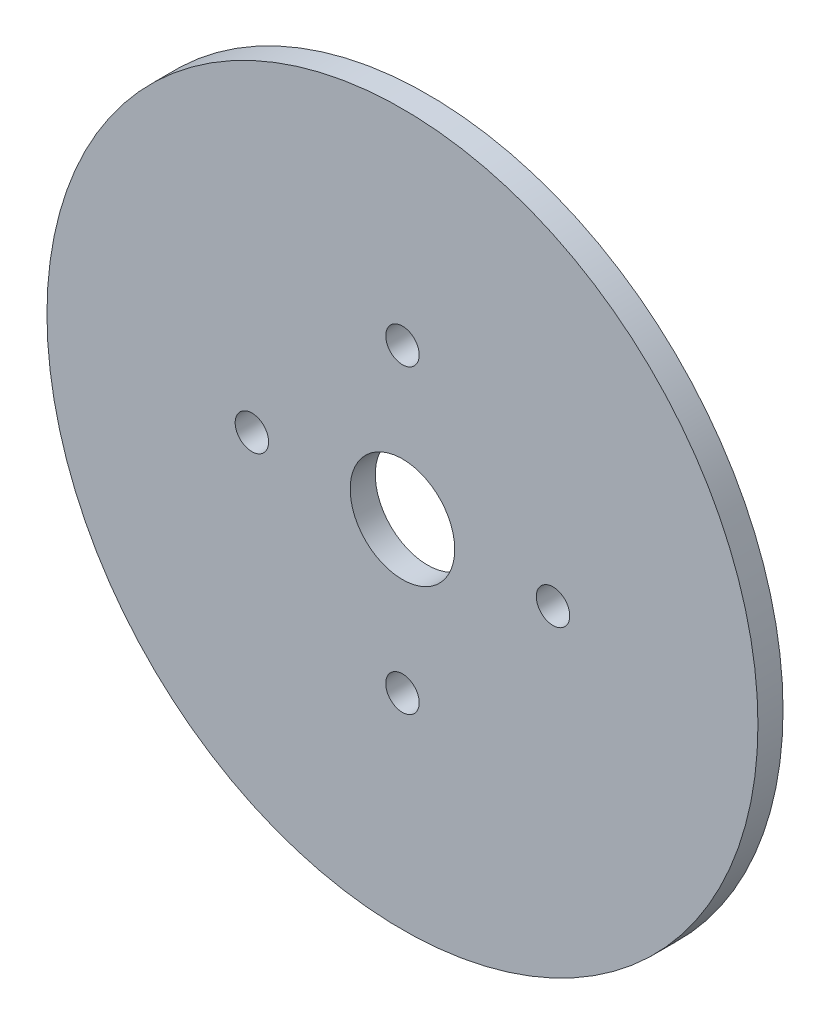
ISO-10303-21;
HEADER;
FILE_DESCRIPTION(('STEP AP214'),'2;1');
FILE_NAME('part.step','',(''),(''),'','','');
FILE_SCHEMA(('AUTOMOTIVE_DESIGN { 1 0 10303 214 1 1 1 1 }'));
ENDSEC;
DATA;
#1=APPLICATION_CONTEXT('core data for automotive mechanical design processes');
#2=APPLICATION_PROTOCOL_DEFINITION('international standard','automotive_design',2000,#1);
#3=PRODUCT_CONTEXT('',#1,'mechanical');
#4=PRODUCT('Part','Part','',(#3));
#5=PRODUCT_RELATED_PRODUCT_CATEGORY('part','',(#4));
#6=PRODUCT_DEFINITION_FORMATION('','',#4);
#7=PRODUCT_DEFINITION_CONTEXT('part definition',#1,'design');
#8=PRODUCT_DEFINITION('design','',#6,#7);
#9=PRODUCT_DEFINITION_SHAPE('','',#8);
#10=(LENGTH_UNIT() NAMED_UNIT(*) SI_UNIT(.MILLI.,.METRE.));
#11=(NAMED_UNIT(*) PLANE_ANGLE_UNIT() SI_UNIT($,.RADIAN.));
#12=(NAMED_UNIT(*) SI_UNIT($,.STERADIAN.) SOLID_ANGLE_UNIT());
#13=UNCERTAINTY_MEASURE_WITH_UNIT(LENGTH_MEASURE(1.E-05),#10,'distance_accuracy_value','');
#14=(GEOMETRIC_REPRESENTATION_CONTEXT(3) GLOBAL_UNCERTAINTY_ASSIGNED_CONTEXT((#13)) GLOBAL_UNIT_ASSIGNED_CONTEXT((#10,
#11,#12)) REPRESENTATION_CONTEXT('',''));
#15=CARTESIAN_POINT('',(0.,0.,0.));
#16=DIRECTION('',(0.,0.,1.));
#17=DIRECTION('',(1.,0.,0.));
#18=AXIS2_PLACEMENT_3D('',#15,#16,#17);
#19=CARTESIAN_POINT('',(0.,0.,6.));
#20=DIRECTION('',(0.,0.,1.));
#21=DIRECTION('',(1.,0.,0.));
#22=AXIS2_PLACEMENT_3D('',#19,#20,#21);
#23=PLANE('',#22);
#24=CARTESIAN_POINT('',(-35.999999999999,-1.0231817578993E-12,6.));
#25=DIRECTION('',(0.,0.,1.));
#26=DIRECTION('',(1.,0.,0.));
#27=AXIS2_PLACEMENT_3D('',#24,#25,#26);
#28=CIRCLE('',#27,4.00000000000164);
#29=CARTESIAN_POINT('',(-31.9999999999973,-1.0231817578993E-12,6.));
#30=VERTEX_POINT('',#29);
#31=EDGE_CURVE('E68',#30,#30,#28,.T.);
#32=ORIENTED_EDGE('',*,*,#31,.F.);
#33=EDGE_LOOP('',(#32));
#34=FACE_BOUND('',#33,.T.);
#35=CARTESIAN_POINT('',(2.03754605884474E-12,-36.,6.));
#36=DIRECTION('',(0.,0.,1.));
#37=DIRECTION('',(1.,0.,0.));
#38=AXIS2_PLACEMENT_3D('',#35,#36,#37);
#39=CIRCLE('',#38,4.00000000000219);
#40=CARTESIAN_POINT('',(4.00000000000423,-36.,6.));
#41=VERTEX_POINT('',#40);
#42=EDGE_CURVE('E62',#41,#41,#39,.T.);
#43=ORIENTED_EDGE('',*,*,#42,.F.);
#44=EDGE_LOOP('',(#43));
#45=FACE_BOUND('',#44,.T.);
#46=CARTESIAN_POINT('',(36.000000000001,1.01877302942237E-12,6.));
#47=DIRECTION('',(0.,0.,1.));
#48=DIRECTION('',(1.,0.,0.));
#49=AXIS2_PLACEMENT_3D('',#46,#47,#48);
#50=CIRCLE('',#49,4.0000000000008);
#51=CARTESIAN_POINT('',(40.0000000000018,1.01877302942237E-12,6.));
#52=VERTEX_POINT('',#51);
#53=EDGE_CURVE('E56',#52,#52,#50,.T.);
#54=ORIENTED_EDGE('',*,*,#53,.F.);
#55=EDGE_LOOP('',(#54));
#56=FACE_BOUND('',#55,.T.);
#57=CARTESIAN_POINT('',(0.,36.,6.));
#58=DIRECTION('',(0.,0.,1.));
#59=DIRECTION('',(1.,0.,0.));
#60=AXIS2_PLACEMENT_3D('',#57,#58,#59);
#61=CIRCLE('',#60,4.);
#62=CARTESIAN_POINT('',(4.,36.,6.));
#63=VERTEX_POINT('',#62);
#64=EDGE_CURVE('E50',#63,#63,#61,.T.);
#65=ORIENTED_EDGE('',*,*,#64,.F.);
#66=EDGE_LOOP('',(#65));
#67=FACE_BOUND('',#66,.T.);
#68=CARTESIAN_POINT('',(0.,0.,6.));
#69=DIRECTION('',(0.,0.,1.));
#70=DIRECTION('',(1.,0.,0.));
#71=AXIS2_PLACEMENT_3D('',#68,#69,#70);
#72=CIRCLE('',#71,85.);
#73=CARTESIAN_POINT('',(85.,0.,6.));
#74=VERTEX_POINT('',#73);
#75=EDGE_CURVE('E10',#74,#74,#72,.T.);
#76=ORIENTED_EDGE('',*,*,#75,.T.);
#77=EDGE_LOOP('',(#76));
#78=FACE_BOUND('',#77,.T.);
#79=CARTESIAN_POINT('',(0.,0.,6.));
#80=DIRECTION('',(0.,0.,1.));
#81=DIRECTION('',(1.,0.,0.));
#82=AXIS2_PLACEMENT_3D('',#79,#80,#81);
#83=CIRCLE('',#82,12.5);
#84=CARTESIAN_POINT('',(12.5,0.,6.));
#85=VERTEX_POINT('',#84);
#86=EDGE_CURVE('E42',#85,#85,#83,.T.);
#87=ORIENTED_EDGE('',*,*,#86,.F.);
#88=EDGE_LOOP('',(#87));
#89=FACE_BOUND('',#88,.T.);
#90=ADVANCED_FACE('F31',(#34,#45,#56,#67,#78,#89),#23,.T.);
#91=CARTESIAN_POINT('',(0.,0.,0.));
#92=DIRECTION('',(0.,0.,1.));
#93=DIRECTION('',(1.,0.,0.));
#94=AXIS2_PLACEMENT_3D('',#91,#92,#93);
#95=PLANE('',#94);
#96=CARTESIAN_POINT('',(-35.999999999999,-1.0231817578993E-12,0.));
#97=DIRECTION('',(0.,0.,1.));
#98=DIRECTION('',(1.,0.,0.));
#99=AXIS2_PLACEMENT_3D('',#96,#97,#98);
#100=CIRCLE('',#99,4.00000000000164);
#101=CARTESIAN_POINT('',(-31.9999999999973,-1.0231817578993E-12,0.));
#102=VERTEX_POINT('',#101);
#103=EDGE_CURVE('E65',#102,#102,#100,.T.);
#104=ORIENTED_EDGE('',*,*,#103,.T.);
#105=EDGE_LOOP('',(#104));
#106=FACE_BOUND('',#105,.T.);
#107=CARTESIAN_POINT('',(2.03754605884474E-12,-36.,0.));
#108=DIRECTION('',(0.,0.,1.));
#109=DIRECTION('',(1.,0.,0.));
#110=AXIS2_PLACEMENT_3D('',#107,#108,#109);
#111=CIRCLE('',#110,4.00000000000219);
#112=CARTESIAN_POINT('',(4.00000000000423,-36.,0.));
#113=VERTEX_POINT('',#112);
#114=EDGE_CURVE('E59',#113,#113,#111,.T.);
#115=ORIENTED_EDGE('',*,*,#114,.T.);
#116=EDGE_LOOP('',(#115));
#117=FACE_BOUND('',#116,.T.);
#118=CARTESIAN_POINT('',(36.000000000001,1.01877302942237E-12,0.));
#119=DIRECTION('',(0.,0.,1.));
#120=DIRECTION('',(1.,0.,0.));
#121=AXIS2_PLACEMENT_3D('',#118,#119,#120);
#122=CIRCLE('',#121,4.0000000000008);
#123=CARTESIAN_POINT('',(40.0000000000018,1.01877302942237E-12,0.));
#124=VERTEX_POINT('',#123);
#125=EDGE_CURVE('E53',#124,#124,#122,.T.);
#126=ORIENTED_EDGE('',*,*,#125,.T.);
#127=EDGE_LOOP('',(#126));
#128=FACE_BOUND('',#127,.T.);
#129=CARTESIAN_POINT('',(0.,36.,0.));
#130=DIRECTION('',(0.,0.,1.));
#131=DIRECTION('',(1.,0.,0.));
#132=AXIS2_PLACEMENT_3D('',#129,#130,#131);
#133=CIRCLE('',#132,4.);
#134=CARTESIAN_POINT('',(4.,36.,0.));
#135=VERTEX_POINT('',#134);
#136=EDGE_CURVE('E47',#135,#135,#133,.T.);
#137=ORIENTED_EDGE('',*,*,#136,.T.);
#138=EDGE_LOOP('',(#137));
#139=FACE_BOUND('',#138,.T.);
#140=CARTESIAN_POINT('',(0.,0.,0.));
#141=DIRECTION('',(0.,0.,1.));
#142=DIRECTION('',(1.,0.,0.));
#143=AXIS2_PLACEMENT_3D('',#140,#141,#142);
#144=CIRCLE('',#143,85.);
#145=CARTESIAN_POINT('',(85.,0.,0.));
#146=VERTEX_POINT('',#145);
#147=EDGE_CURVE('E35',#146,#146,#144,.T.);
#148=ORIENTED_EDGE('',*,*,#147,.F.);
#149=EDGE_LOOP('',(#148));
#150=FACE_BOUND('',#149,.T.);
#151=CARTESIAN_POINT('',(0.,0.,0.));
#152=DIRECTION('',(0.,0.,1.));
#153=DIRECTION('',(1.,0.,0.));
#154=AXIS2_PLACEMENT_3D('',#151,#152,#153);
#155=CIRCLE('',#154,12.5);
#156=CARTESIAN_POINT('',(12.5,0.,0.));
#157=VERTEX_POINT('',#156);
#158=EDGE_CURVE('E44',#157,#157,#155,.T.);
#159=ORIENTED_EDGE('',*,*,#158,.T.);
#160=EDGE_LOOP('',(#159));
#161=FACE_BOUND('',#160,.T.);
#162=ADVANCED_FACE('F74',(#106,#117,#128,#139,#150,#161),#95,.F.);
#163=CARTESIAN_POINT('',(0.,0.,6.));
#164=DIRECTION('',(0.,0.,-1.));
#165=DIRECTION('',(-1.,0.,0.));
#166=AXIS2_PLACEMENT_3D('',#163,#164,#165);
#167=CYLINDRICAL_SURFACE('',#166,85.);
#168=ORIENTED_EDGE('',*,*,#75,.F.);
#169=EDGE_LOOP('',(#168));
#170=FACE_BOUND('',#169,.T.);
#171=ORIENTED_EDGE('',*,*,#147,.T.);
#172=EDGE_LOOP('',(#171));
#173=FACE_BOUND('',#172,.T.);
#174=ADVANCED_FACE('F33',(#170,#173),#167,.T.);
#175=CARTESIAN_POINT('',(0.,0.,6.));
#176=DIRECTION('',(0.,0.,-1.));
#177=DIRECTION('',(-1.,0.,0.));
#178=AXIS2_PLACEMENT_3D('',#175,#176,#177);
#179=CYLINDRICAL_SURFACE('',#178,12.5);
#180=ORIENTED_EDGE('',*,*,#86,.T.);
#181=EDGE_LOOP('',(#180));
#182=FACE_BOUND('',#181,.T.);
#183=ORIENTED_EDGE('',*,*,#158,.F.);
#184=EDGE_LOOP('',(#183));
#185=FACE_BOUND('',#184,.T.);
#186=ADVANCED_FACE('F95',(#182,#185),#179,.F.);
#187=CARTESIAN_POINT('',(0.,36.,0.));
#188=DIRECTION('',(0.,0.,1.));
#189=DIRECTION('',(1.,0.,0.));
#190=AXIS2_PLACEMENT_3D('',#187,#188,#189);
#191=CYLINDRICAL_SURFACE('',#190,4.);
#192=ORIENTED_EDGE('',*,*,#136,.F.);
#193=EDGE_LOOP('',(#192));
#194=FACE_BOUND('',#193,.T.);
#195=ORIENTED_EDGE('',*,*,#64,.T.);
#196=EDGE_LOOP('',(#195));
#197=FACE_BOUND('',#196,.T.);
#198=ADVANCED_FACE('F98',(#194,#197),#191,.F.);
#199=CARTESIAN_POINT('',(36.000000000001,1.01877302942237E-12,0.));
#200=DIRECTION('',(0.,0.,1.));
#201=DIRECTION('',(1.,0.,0.));
#202=AXIS2_PLACEMENT_3D('',#199,#200,#201);
#203=CYLINDRICAL_SURFACE('',#202,4.0000000000008);
#204=ORIENTED_EDGE('',*,*,#125,.F.);
#205=EDGE_LOOP('',(#204));
#206=FACE_BOUND('',#205,.T.);
#207=ORIENTED_EDGE('',*,*,#53,.T.);
#208=EDGE_LOOP('',(#207));
#209=FACE_BOUND('',#208,.T.);
#210=ADVANCED_FACE('F111',(#206,#209),#203,.F.);
#211=CARTESIAN_POINT('',(2.03754605884474E-12,-36.,0.));
#212=DIRECTION('',(0.,0.,1.));
#213=DIRECTION('',(1.,0.,0.));
#214=AXIS2_PLACEMENT_3D('',#211,#212,#213);
#215=CYLINDRICAL_SURFACE('',#214,4.00000000000219);
#216=ORIENTED_EDGE('',*,*,#114,.F.);
#217=EDGE_LOOP('',(#216));
#218=FACE_BOUND('',#217,.T.);
#219=ORIENTED_EDGE('',*,*,#42,.T.);
#220=EDGE_LOOP('',(#219));
#221=FACE_BOUND('',#220,.T.);
#222=ADVANCED_FACE('F80',(#218,#221),#215,.F.);
#223=CARTESIAN_POINT('',(-35.999999999999,-1.0231817578993E-12,0.));
#224=DIRECTION('',(0.,0.,1.));
#225=DIRECTION('',(1.,0.,0.));
#226=AXIS2_PLACEMENT_3D('',#223,#224,#225);
#227=CYLINDRICAL_SURFACE('',#226,4.00000000000164);
#228=ORIENTED_EDGE('',*,*,#103,.F.);
#229=EDGE_LOOP('',(#228));
#230=FACE_BOUND('',#229,.T.);
#231=ORIENTED_EDGE('',*,*,#31,.T.);
#232=EDGE_LOOP('',(#231));
#233=FACE_BOUND('',#232,.T.);
#234=ADVANCED_FACE('F77',(#230,#233),#227,.F.);
#235=CLOSED_SHELL('',(#90,#162,#174,#186,#198,#210,#222,#234));
#236=MANIFOLD_SOLID_BREP('B2',#235);
#237=ADVANCED_BREP_SHAPE_REPRESENTATION('',(#18,#236),#14);
#238=SHAPE_DEFINITION_REPRESENTATION(#9,#237);
ENDSEC;
END-ISO-10303-21;
